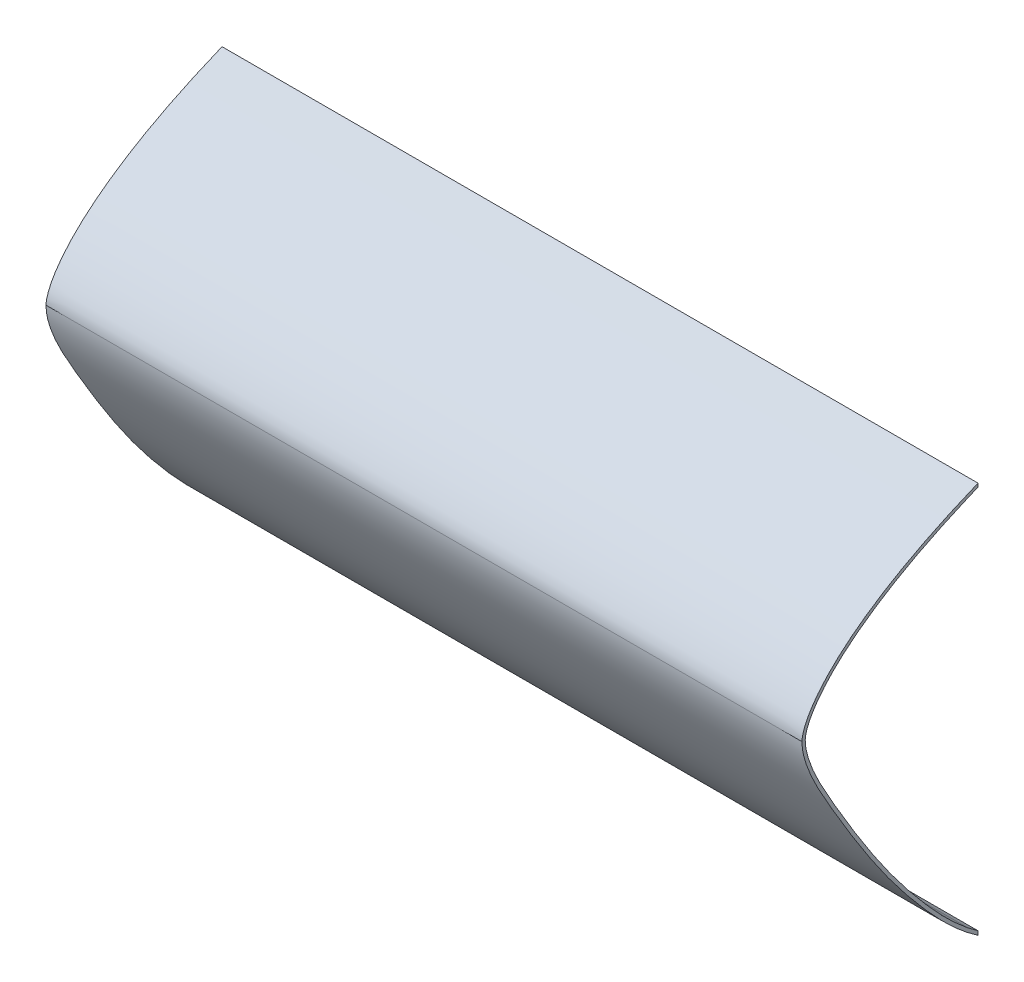
ISO-10303-21;
HEADER;
FILE_DESCRIPTION(('STEP AP214'),'2;1');
FILE_NAME('part.step','',(''),(''),'','','');
FILE_SCHEMA(('AUTOMOTIVE_DESIGN { 1 0 10303 214 1 1 1 1 }'));
ENDSEC;
DATA;
#1=APPLICATION_CONTEXT('core data for automotive mechanical design processes');
#2=APPLICATION_PROTOCOL_DEFINITION('international standard','automotive_design',2000,#1);
#3=PRODUCT_CONTEXT('',#1,'mechanical');
#4=PRODUCT('Part','Part','',(#3));
#5=PRODUCT_RELATED_PRODUCT_CATEGORY('part','',(#4));
#6=PRODUCT_DEFINITION_FORMATION('','',#4);
#7=PRODUCT_DEFINITION_CONTEXT('part definition',#1,'design');
#8=PRODUCT_DEFINITION('design','',#6,#7);
#9=PRODUCT_DEFINITION_SHAPE('','',#8);
#10=(LENGTH_UNIT() NAMED_UNIT(*) SI_UNIT(.MILLI.,.METRE.));
#11=(NAMED_UNIT(*) PLANE_ANGLE_UNIT() SI_UNIT($,.RADIAN.));
#12=(NAMED_UNIT(*) SI_UNIT($,.STERADIAN.) SOLID_ANGLE_UNIT());
#13=UNCERTAINTY_MEASURE_WITH_UNIT(LENGTH_MEASURE(1.E-05),#10,'distance_accuracy_value','');
#14=(GEOMETRIC_REPRESENTATION_CONTEXT(3) GLOBAL_UNCERTAINTY_ASSIGNED_CONTEXT((#13)) GLOBAL_UNIT_ASSIGNED_CONTEXT((#10,
#11,#12)) REPRESENTATION_CONTEXT('',''));
#15=CARTESIAN_POINT('',(0.,0.,0.));
#16=DIRECTION('',(0.,0.,1.));
#17=DIRECTION('',(1.,0.,0.));
#18=AXIS2_PLACEMENT_3D('',#15,#16,#17);
#19=CARTESIAN_POINT('',(266.7,-24.5074572882678,-789.290794794188));
#20=CARTESIAN_POINT('',(266.7,-23.100990822762,-780.614043856544));
#21=CARTESIAN_POINT('',(266.7,-21.0631816428031,-763.122872794764));
#22=CARTESIAN_POINT('',(266.7,-20.0352627306667,-736.775050872084));
#23=CARTESIAN_POINT('',(266.7,-20.2591998046104,-710.439693759353));
#24=CARTESIAN_POINT('',(266.7,-21.7598239259105,-675.368134105105));
#25=CARTESIAN_POINT('',(266.7,-25.5196834895329,-631.656292139503));
#26=CARTESIAN_POINT('',(266.7,-32.1431436086785,-579.449134828056));
#27=CARTESIAN_POINT('',(266.7,-40.3239611783185,-527.476779116881));
#28=CARTESIAN_POINT('',(266.7,-49.5822384711546,-475.697383860633));
#29=CARTESIAN_POINT('',(266.7,-59.4829281927388,-424.047472781757));
#30=CARTESIAN_POINT('',(266.7,-69.5596595695538,-372.441584722318));
#31=CARTESIAN_POINT('',(266.7,-79.2929568217852,-320.780260554555));
#32=CARTESIAN_POINT('',(266.7,-86.5747829680276,-277.588940898692));
#33=CARTESIAN_POINT('',(266.7,-91.4627744990053,-242.901110379607));
#34=CARTESIAN_POINT('',(266.7,-94.5068033648367,-216.810363835389));
#35=CARTESIAN_POINT('',(266.7,-96.7472514191075,-190.644182857328));
#36=CARTESIAN_POINT('',(266.7,-97.9545698036435,-164.414750871362));
#37=CARTESIAN_POINT('',(266.7,-97.7922976674635,-138.172359339796));
#38=CARTESIAN_POINT('',(266.7,-96.1813002834322,-116.355568341884));
#39=CARTESIAN_POINT('',(266.7,-93.5961307876831,-99.0883255351352));
#40=CARTESIAN_POINT('',(266.7,-90.8757461882616,-86.283147346043));
#41=CARTESIAN_POINT('',(266.7,-87.3558320405155,-73.6522350944922));
#42=CARTESIAN_POINT('',(266.7,-82.3375796283404,-61.6337008298024));
#43=CARTESIAN_POINT('',(266.7,-75.2474279990914,-50.6544833890106));
#44=CARTESIAN_POINT('',(266.7,-67.7200389950008,-42.8536104612325));
#45=CARTESIAN_POINT('',(266.7,-61.1825485276851,-37.0476347276397));
#46=CARTESIAN_POINT('',(266.7,-54.4810024514934,-31.45763959781));
#47=CARTESIAN_POINT('',(266.7,-45.7682269263305,-24.9199180091646));
#48=CARTESIAN_POINT('',(266.7,-34.7964723438076,-17.7321879669621));
#49=CARTESIAN_POINT('',(266.7,-25.4664029849051,-12.0814505739614));
#50=CARTESIAN_POINT('',(266.7,-17.8738398221118,-7.69425128420265));
#51=CARTESIAN_POINT('',(266.7,-12.1314475274385,-4.55768908706909));
#52=CARTESIAN_POINT('',(266.7,-7.20319801415783,-2.45214991226987));
#53=CARTESIAN_POINT('',(266.7,-3.59720544979583,-1.41675837015921));
#54=CARTESIAN_POINT('',(266.7,-1.82586056757744,-1.10276659026962));
#55=CARTESIAN_POINT('',(266.7,-0.823363516528401,-1.02892542519056));
#56=CARTESIAN_POINT('',(266.7,-0.277884035092441,-1.00992186429154));
#57=CARTESIAN_POINT('',(266.7,-0.0105715542449848,-1.00091942828998));
#58=B_SPLINE_CURVE_WITH_KNOTS('',3,(#19,#20,#21,#22,#23,#24,#25,#26,#27,#28,#29,#30,#31,#32,#33,
#34,#35,#36,#37,#38,#39,#40,#41,#42,#43,#44,#45,#46,#47,#48,#49,#50,#51,#52,#53,#54,#55,#56,
#57),.UNSPECIFIED.,.F.,.F.,(4,1,1,1,1,1,1,1,1,1,1,1,1,1,1,1,1,1,1,1,1,1,1,1,1,1,1,1,1,1,1,1,1,1,
1,1,4),(5.1726420586601E-05,0.0308151389199881,0.0615785514193897,0.0923419639187912,
0.123105376418193,0.184632201416996,0.246159026415799,0.307685851414602,0.369212676413405,
0.430739501412208,0.492266326411011,0.553793151409815,0.615319976408618,0.646083388908019,
0.676846801407421,0.707610213906822,0.738373626406224,0.769137038905625,0.799900451405027,
0.815282157654728,0.830663863904429,0.846045570154129,0.86142727640383,0.876808982653531,
0.892190688903232,0.899881542028082,0.907572395152932,0.922954101402633,0.938335807652334,
0.953717513902035,0.961408367026885,0.969099220151736,0.976790073276586,0.980635499839011,
0.982558213120224,0.98351956976083,0.984480926401436),.UNSPECIFIED.);
#59=DIRECTION('',(-1.,0.,0.));
#60=VECTOR('',#59,1.);
#61=SURFACE_OF_LINEAR_EXTRUSION('',#58,#60);
#62=CARTESIAN_POINT('',(34.925,-24.5074572882678,-789.290794794188));
#63=CARTESIAN_POINT('',(34.925,-23.100990822762,-780.614043856544));
#64=CARTESIAN_POINT('',(34.925,-21.0631816428031,-763.122872794764));
#65=CARTESIAN_POINT('',(34.925,-20.0352627306667,-736.775050872084));
#66=CARTESIAN_POINT('',(34.925,-20.2591998046104,-710.439693759353));
#67=CARTESIAN_POINT('',(34.925,-21.7598239259105,-675.368134105105));
#68=CARTESIAN_POINT('',(34.925,-25.5196834895329,-631.656292139503));
#69=CARTESIAN_POINT('',(34.925,-32.1431436086785,-579.449134828056));
#70=CARTESIAN_POINT('',(34.925,-40.3239611783185,-527.476779116881));
#71=CARTESIAN_POINT('',(34.925,-49.5822384711546,-475.697383860633));
#72=CARTESIAN_POINT('',(34.925,-59.4829281927388,-424.047472781757));
#73=CARTESIAN_POINT('',(34.925,-69.5596595695538,-372.441584722318));
#74=CARTESIAN_POINT('',(34.925,-79.2929568217852,-320.780260554555));
#75=CARTESIAN_POINT('',(34.925,-86.5747829680276,-277.588940898692));
#76=CARTESIAN_POINT('',(34.925,-91.4627744990053,-242.901110379607));
#77=CARTESIAN_POINT('',(34.925,-94.5068033648367,-216.810363835389));
#78=CARTESIAN_POINT('',(34.925,-96.7472514191075,-190.644182857328));
#79=CARTESIAN_POINT('',(34.925,-97.9545698036435,-164.414750871362));
#80=CARTESIAN_POINT('',(34.925,-97.7922976674635,-138.172359339796));
#81=CARTESIAN_POINT('',(34.925,-96.1813002834322,-116.355568341884));
#82=CARTESIAN_POINT('',(34.925,-93.5961307876831,-99.0883255351352));
#83=CARTESIAN_POINT('',(34.925,-90.8757461882616,-86.283147346043));
#84=CARTESIAN_POINT('',(34.925,-87.3558320405155,-73.6522350944922));
#85=CARTESIAN_POINT('',(34.925,-82.3375796283404,-61.6337008298024));
#86=CARTESIAN_POINT('',(34.925,-75.2474279990914,-50.6544833890106));
#87=CARTESIAN_POINT('',(34.925,-67.7200389950008,-42.8536104612325));
#88=CARTESIAN_POINT('',(34.925,-61.1825485276851,-37.0476347276397));
#89=CARTESIAN_POINT('',(34.925,-54.4810024514934,-31.45763959781));
#90=CARTESIAN_POINT('',(34.925,-45.7682269263305,-24.9199180091646));
#91=CARTESIAN_POINT('',(34.925,-34.7964723438076,-17.7321879669621));
#92=CARTESIAN_POINT('',(34.925,-25.4664029849051,-12.0814505739614));
#93=CARTESIAN_POINT('',(34.925,-17.8738398221118,-7.69425128420265));
#94=CARTESIAN_POINT('',(34.925,-12.1314475274385,-4.55768908706909));
#95=CARTESIAN_POINT('',(34.925,-7.20319801415783,-2.45214991226987));
#96=CARTESIAN_POINT('',(34.925,-3.59720544979583,-1.41675837015921));
#97=CARTESIAN_POINT('',(34.925,-1.82586056757744,-1.10276659026962));
#98=CARTESIAN_POINT('',(34.925,-0.823363516528401,-1.02892542519056));
#99=CARTESIAN_POINT('',(34.925,-0.277884035092441,-1.00992186429154));
#100=CARTESIAN_POINT('',(34.925,-0.0105715542449848,-1.00091942828998));
#101=B_SPLINE_CURVE_WITH_KNOTS('',3,(#62,#63,#64,#65,#66,#67,#68,#69,#70,#71,#72,#73,#74,#75,
#76,#77,#78,#79,#80,#81,#82,#83,#84,#85,#86,#87,#88,#89,#90,#91,#92,#93,#94,#95,#96,#97,#98,#99,
#100),.UNSPECIFIED.,.F.,.F.,(4,1,1,1,1,1,1,1,1,1,1,1,1,1,1,1,1,1,1,1,1,1,1,1,1,1,1,1,1,1,1,1,1,
1,1,1,4),(5.1726420586601E-05,0.0308151389199881,0.0615785514193897,0.0923419639187912,
0.123105376418193,0.184632201416996,0.246159026415799,0.307685851414602,0.369212676413405,
0.430739501412208,0.492266326411011,0.553793151409815,0.615319976408618,0.646083388908019,
0.676846801407421,0.707610213906822,0.738373626406224,0.769137038905625,0.799900451405027,
0.815282157654728,0.830663863904429,0.846045570154129,0.86142727640383,0.876808982653531,
0.892190688903232,0.899881542028082,0.907572395152932,0.922954101402633,0.938335807652334,
0.953717513902035,0.961408367026885,0.969099220151736,0.976790073276586,0.980635499839011,
0.982558213120224,0.98351956976083,0.984480926401436),.UNSPECIFIED.);
#102=CARTESIAN_POINT('',(34.925,-74.8249698289489,-50.7999999997794));
#103=VERTEX_POINT('',#102);
#104=CARTESIAN_POINT('',(34.925,-0.0105715542449848,-1.00091942828998));
#105=VERTEX_POINT('',#104);
#106=EDGE_CURVE('E210',#103,#105,#101,.T.);
#107=ORIENTED_EDGE('',*,*,#106,.T.);
#108=DIRECTION('',(-1.,0.,0.));
#109=VECTOR('',#108,1.);
#110=CARTESIAN_POINT('',(266.7,-0.0105715542449848,-1.00091942828998));
#111=LINE('',#110,#109);
#112=CARTESIAN_POINT('',(266.7,-0.0105715542449848,-1.00091942828998));
#113=VERTEX_POINT('',#112);
#114=EDGE_CURVE('E11',#113,#105,#111,.T.);
#115=ORIENTED_EDGE('',*,*,#114,.F.);
#116=CARTESIAN_POINT('',(266.7,-74.8249698289489,-50.7999999997794));
#117=VERTEX_POINT('',#116);
#118=EDGE_CURVE('E174',#117,#113,#58,.T.);
#119=ORIENTED_EDGE('',*,*,#118,.F.);
#120=DIRECTION('',(-1.,0.,0.));
#121=VECTOR('',#120,1.);
#122=CARTESIAN_POINT('',(266.7,-74.8249698289489,-50.7999999997794));
#123=LINE('',#122,#121);
#124=EDGE_CURVE('E40',#117,#103,#123,.T.);
#125=ORIENTED_EDGE('',*,*,#124,.T.);
#126=EDGE_LOOP('',(#107,#115,#119,#125));
#127=FACE_BOUND('',#126,.T.);
#128=ADVANCED_FACE('F36',(#127),#61,.F.);
#129=CARTESIAN_POINT('',(266.7,-0.0105715542452681,-1.00091942828997));
#130=CARTESIAN_POINT('',(266.7,0.114040702430054,-1.0077713892526));
#131=CARTESIAN_POINT('',(266.7,0.373573946351793,-1.02267814370625));
#132=CARTESIAN_POINT('',(266.7,0.808496425626842,-1.07091571810173));
#133=CARTESIAN_POINT('',(266.7,1.62955284660506,-1.23457798343074));
#134=CARTESIAN_POINT('',(266.7,3.28941724619422,-1.76639239978069));
#135=CARTESIAN_POINT('',(266.7,6.52065295439227,-3.32977957028124));
#136=CARTESIAN_POINT('',(266.7,10.7521230342508,-6.42954257803141));
#137=CARTESIAN_POINT('',(266.7,15.3220653664984,-10.7866624045209));
#138=CARTESIAN_POINT('',(266.7,19.4551389066011,-15.6144946537094));
#139=CARTESIAN_POINT('',(266.7,23.2421065636616,-20.7190912359694));
#140=CARTESIAN_POINT('',(266.7,27.8818635830338,-27.8301257757577));
#141=CARTESIAN_POINT('',(266.7,33.0526699425482,-37.1258570237104));
#142=CARTESIAN_POINT('',(266.7,38.4699988062142,-48.7006019533348));
#143=CARTESIAN_POINT('',(266.7,43.2586994140153,-60.554684269467));
#144=CARTESIAN_POINT('',(266.7,47.5157663270679,-72.6183427392226));
#145=CARTESIAN_POINT('',(266.7,52.5847537322259,-88.9109673754412));
#146=CARTESIAN_POINT('',(266.7,57.9456674243507,-109.571499581115));
#147=CARTESIAN_POINT('',(266.7,63.1156006005303,-134.662571043522));
#148=CARTESIAN_POINT('',(266.7,67.2137979677469,-159.955476890662));
#149=CARTESIAN_POINT('',(266.7,70.3743923087456,-185.386357323335));
#150=CARTESIAN_POINT('',(266.7,72.6538311658042,-210.910406797062));
#151=CARTESIAN_POINT('',(266.7,74.5203795449252,-245.029776596433));
#152=CARTESIAN_POINT('',(266.7,74.7799936498403,-279.21396421962));
#153=CARTESIAN_POINT('',(266.7,73.5458851692162,-313.365437183596));
#154=CARTESIAN_POINT('',(266.7,71.3203163709263,-347.467976918165));
#155=CARTESIAN_POINT('',(266.7,66.9977719420972,-389.985559505636));
#156=CARTESIAN_POINT('',(266.7,59.8424535642073,-440.766917426449));
#157=CARTESIAN_POINT('',(266.7,51.0591202019668,-491.296780074609));
#158=CARTESIAN_POINT('',(266.7,40.9550752519973,-541.58210338622));
#159=CARTESIAN_POINT('',(266.7,29.787578407225,-591.645313181676));
#160=CARTESIAN_POINT('',(266.7,19.7880426743993,-633.20668903599));
#161=CARTESIAN_POINT('',(266.7,11.4508482044253,-666.372578030713));
#162=CARTESIAN_POINT('',(266.7,5.03899993633112,-691.207818332635));
#163=CARTESIAN_POINT('',(266.7,-1.53568956714727,-715.996424383667));
#164=CARTESIAN_POINT('',(266.7,-8.35598015991596,-740.721778453262));
#165=CARTESIAN_POINT('',(266.7,-14.2813303329001,-761.239390145478));
#166=CARTESIAN_POINT('',(266.7,-19.8539671257288,-777.355415120436));
#167=CARTESIAN_POINT('',(266.7,-22.9508793400488,-785.3163619528));
#168=CARTESIAN_POINT('',(266.7,-24.5074572882678,-789.290794794188));
#169=B_SPLINE_CURVE_WITH_KNOTS('',3,(#129,#130,#131,#132,#133,#134,#135,#136,#137,#138,#139,
#140,#141,#142,#143,#144,#145,#146,#147,#148,#149,#150,#151,#152,#153,#154,#155,#156,#157,#158,
#159,#160,#161,#162,#163,#164,#165,#166,#167,#168),.UNSPECIFIED.,.F.,.F.,(4,1,1,1,1,1,1,1,1,1,1,
1,1,1,1,1,1,1,1,1,1,1,1,1,1,1,1,1,1,1,1,1,1,1,1,1,1,4),(0.0158982001693718,0.0163786926540949,
0.0168591851388182,0.0178201701082647,0.0197421400471575,0.0235860799249431,0.0312739596805144,
0.0389618394360858,0.0466497191916572,0.0543375989472285,0.0620254787027999,0.0774012382139426,
0.0927769977250852,0.108152757236228,0.123528516747371,0.138904276258513,0.169655795280799,
0.200407314303084,0.231158833325369,0.261910352347655,0.29266187136994,0.323413390392225,
0.384916428436796,0.415667947459081,0.446419466481367,0.507922504525937,0.569425542570508,
0.630928580615079,0.69243161865965,0.75393465670422,0.815437694748791,0.846189213771076,
0.876940732793362,0.907692251815647,0.938443770837933,0.969195289860218,0.984571049371361,
0.999946808882503),.UNSPECIFIED.);
#170=DIRECTION('',(-1.,0.,0.));
#171=VECTOR('',#170,1.);
#172=SURFACE_OF_LINEAR_EXTRUSION('',#169,#171);
#173=CARTESIAN_POINT('',(34.925,-0.0105715542452681,-1.00091942828997));
#174=CARTESIAN_POINT('',(34.925,0.114040702430054,-1.0077713892526));
#175=CARTESIAN_POINT('',(34.925,0.373573946351793,-1.02267814370625));
#176=CARTESIAN_POINT('',(34.925,0.808496425626842,-1.07091571810173));
#177=CARTESIAN_POINT('',(34.925,1.62955284660506,-1.23457798343074));
#178=CARTESIAN_POINT('',(34.925,3.28941724619422,-1.76639239978069));
#179=CARTESIAN_POINT('',(34.925,6.52065295439227,-3.32977957028124));
#180=CARTESIAN_POINT('',(34.925,10.7521230342508,-6.42954257803141));
#181=CARTESIAN_POINT('',(34.925,15.3220653664984,-10.7866624045209));
#182=CARTESIAN_POINT('',(34.925,19.4551389066011,-15.6144946537094));
#183=CARTESIAN_POINT('',(34.925,23.2421065636616,-20.7190912359694));
#184=CARTESIAN_POINT('',(34.925,27.8818635830338,-27.8301257757577));
#185=CARTESIAN_POINT('',(34.925,33.0526699425482,-37.1258570237104));
#186=CARTESIAN_POINT('',(34.925,38.4699988062142,-48.7006019533348));
#187=CARTESIAN_POINT('',(34.925,43.2586994140153,-60.554684269467));
#188=CARTESIAN_POINT('',(34.925,47.5157663270679,-72.6183427392226));
#189=CARTESIAN_POINT('',(34.925,52.5847537322259,-88.9109673754412));
#190=CARTESIAN_POINT('',(34.925,57.9456674243507,-109.571499581115));
#191=CARTESIAN_POINT('',(34.925,63.1156006005303,-134.662571043522));
#192=CARTESIAN_POINT('',(34.925,67.2137979677469,-159.955476890662));
#193=CARTESIAN_POINT('',(34.925,70.3743923087456,-185.386357323335));
#194=CARTESIAN_POINT('',(34.925,72.6538311658042,-210.910406797062));
#195=CARTESIAN_POINT('',(34.925,74.5203795449252,-245.029776596433));
#196=CARTESIAN_POINT('',(34.925,74.7799936498403,-279.21396421962));
#197=CARTESIAN_POINT('',(34.925,73.5458851692162,-313.365437183596));
#198=CARTESIAN_POINT('',(34.925,71.3203163709263,-347.467976918165));
#199=CARTESIAN_POINT('',(34.925,66.9977719420972,-389.985559505636));
#200=CARTESIAN_POINT('',(34.925,59.8424535642073,-440.766917426449));
#201=CARTESIAN_POINT('',(34.925,51.0591202019668,-491.296780074609));
#202=CARTESIAN_POINT('',(34.925,40.9550752519973,-541.58210338622));
#203=CARTESIAN_POINT('',(34.925,29.787578407225,-591.645313181676));
#204=CARTESIAN_POINT('',(34.925,19.7880426743993,-633.20668903599));
#205=CARTESIAN_POINT('',(34.925,11.4508482044253,-666.372578030713));
#206=CARTESIAN_POINT('',(34.925,5.03899993633112,-691.207818332635));
#207=CARTESIAN_POINT('',(34.925,-1.53568956714727,-715.996424383667));
#208=CARTESIAN_POINT('',(34.925,-8.35598015991596,-740.721778453262));
#209=CARTESIAN_POINT('',(34.925,-14.2813303329001,-761.239390145478));
#210=CARTESIAN_POINT('',(34.925,-19.8539671257288,-777.355415120436));
#211=CARTESIAN_POINT('',(34.925,-22.9508793400488,-785.3163619528));
#212=CARTESIAN_POINT('',(34.925,-24.5074572882678,-789.290794794188));
#213=B_SPLINE_CURVE_WITH_KNOTS('',3,(#173,#174,#175,#176,#177,#178,#179,#180,#181,#182,#183,
#184,#185,#186,#187,#188,#189,#190,#191,#192,#193,#194,#195,#196,#197,#198,#199,#200,#201,#202,
#203,#204,#205,#206,#207,#208,#209,#210,#211,#212),.UNSPECIFIED.,.F.,.F.,(4,1,1,1,1,1,1,1,1,1,1,
1,1,1,1,1,1,1,1,1,1,1,1,1,1,1,1,1,1,1,1,1,1,1,1,1,1,4),(0.0158982001693718,0.0163786926540949,
0.0168591851388182,0.0178201701082647,0.0197421400471575,0.0235860799249431,0.0312739596805144,
0.0389618394360858,0.0466497191916572,0.0543375989472285,0.0620254787027999,0.0774012382139426,
0.0927769977250852,0.108152757236228,0.123528516747371,0.138904276258513,0.169655795280799,
0.200407314303084,0.231158833325369,0.261910352347655,0.29266187136994,0.323413390392225,
0.384916428436796,0.415667947459081,0.446419466481367,0.507922504525937,0.569425542570508,
0.630928580615079,0.69243161865965,0.75393465670422,0.815437694748791,0.846189213771076,
0.876940732793362,0.907692251815647,0.938443770837933,0.969195289860218,0.984571049371361,
0.999946808882503),.UNSPECIFIED.);
#214=CARTESIAN_POINT('',(34.925,39.2481231711083,-50.8));
#215=VERTEX_POINT('',#214);
#216=EDGE_CURVE('E88',#105,#215,#213,.T.);
#217=ORIENTED_EDGE('',*,*,#216,.T.);
#218=DIRECTION('',(-1.,0.,0.));
#219=VECTOR('',#218,1.);
#220=CARTESIAN_POINT('',(266.7,39.2481231711083,-50.8));
#221=LINE('',#220,#219);
#222=CARTESIAN_POINT('',(266.7,39.2481231711083,-50.8));
#223=VERTEX_POINT('',#222);
#224=EDGE_CURVE('E46',#223,#215,#221,.T.);
#225=ORIENTED_EDGE('',*,*,#224,.F.);
#226=EDGE_CURVE('E54',#113,#223,#169,.T.);
#227=ORIENTED_EDGE('',*,*,#226,.F.);
#228=ORIENTED_EDGE('',*,*,#114,.T.);
#229=EDGE_LOOP('',(#217,#225,#227,#228));
#230=FACE_BOUND('',#229,.T.);
#231=ADVANCED_FACE('F149',(#230),#172,.F.);
#232=CARTESIAN_POINT('',(266.7,-24.5074523147149,-789.290776610833));
#233=CARTESIAN_POINT('',(266.7,-22.9508744367013,-785.316343884076));
#234=CARTESIAN_POINT('',(266.7,-19.8539626401927,-777.355397182078));
#235=CARTESIAN_POINT('',(266.7,-14.2813269120629,-761.239372327148));
#236=CARTESIAN_POINT('',(266.7,-8.35597741402668,-740.721760986467));
#237=CARTESIAN_POINT('',(266.7,-1.53568705011436,-715.996407484722));
#238=CARTESIAN_POINT('',(266.7,5.03900213459,-691.207801971334));
#239=CARTESIAN_POINT('',(266.7,11.4508501691391,-666.372562229981));
#240=CARTESIAN_POINT('',(266.7,19.7880443068953,-633.206673978885));
#241=CARTESIAN_POINT('',(266.7,29.7875796313035,-591.645299060978));
#242=CARTESIAN_POINT('',(266.7,40.9550759630107,-541.582090396035));
#243=CARTESIAN_POINT('',(266.7,51.059120386154,-491.296768227991));
#244=CARTESIAN_POINT('',(266.7,59.8424532201647,-440.766906741374));
#245=CARTESIAN_POINT('',(266.7,66.9977710701701,-389.985550008334));
#246=CARTESIAN_POINT('',(266.7,71.320315093406,-347.467968433537));
#247=CARTESIAN_POINT('',(266.7,73.5458835501345,-313.365429537516));
#248=CARTESIAN_POINT('',(266.7,74.7799917159271,-279.21395742446));
#249=CARTESIAN_POINT('',(266.7,74.5203773652254,-245.029770666932));
#250=CARTESIAN_POINT('',(266.7,72.6538287923752,-210.910401752373));
#251=CARTESIAN_POINT('',(266.7,70.3743898225911,-185.386352949068));
#252=CARTESIAN_POINT('',(266.7,67.2137954131363,-159.955473188296));
#253=CARTESIAN_POINT('',(266.7,63.1155980063945,-134.662568023428));
#254=CARTESIAN_POINT('',(266.7,57.945664824236,-109.57149725794));
#255=CARTESIAN_POINT('',(266.7,52.5847511620715,-88.9109656463125));
#256=CARTESIAN_POINT('',(266.7,47.5157638070041,-72.6183415034526));
#257=CARTESIAN_POINT('',(266.7,43.2586969489353,-60.5546834115465));
#258=CARTESIAN_POINT('',(266.7,38.4699964176601,-48.7006014884342));
#259=CARTESIAN_POINT('',(266.7,33.0526676620866,-37.1258569671738));
#260=CARTESIAN_POINT('',(266.7,27.8818614287451,-27.830126078208));
#261=CARTESIAN_POINT('',(266.7,23.2421045519939,-20.7190918518584));
#262=CARTESIAN_POINT('',(266.7,19.4551370279139,-15.6144955117341));
#263=CARTESIAN_POINT('',(266.7,15.322063664281,-10.7866635242817));
#264=CARTESIAN_POINT('',(266.7,10.7521215765983,-6.42954397937692));
#265=CARTESIAN_POINT('',(266.7,6.52065180860318,-3.32978123179313));
#266=CARTESIAN_POINT('',(266.7,3.2894164680873,-1.76639425342375));
#267=CARTESIAN_POINT('',(266.7,1.62955235710492,-1.23457992726384));
#268=CARTESIAN_POINT('',(266.7,0.808496148203222,-1.07091770373055));
#269=CARTESIAN_POINT('',(266.7,0.37357387230636,-1.02268014491042));
#270=CARTESIAN_POINT('',(266.7,0.114040657530818,-1.00777338993929));
#271=CARTESIAN_POINT('',(266.7,-0.0105715755317698,-1.00092143014071));
#272=B_SPLINE_CURVE_WITH_KNOTS('',3,(#232,#233,#234,#235,#236,#237,#238,#239,#240,#241,#242,
#243,#244,#245,#246,#247,#248,#249,#250,#251,#252,#253,#254,#255,#256,#257,#258,#259,#260,#261,
#262,#263,#264,#265,#266,#267,#268,#269,#270,#271),.UNSPECIFIED.,.F.,.F.,(4,1,1,1,1,1,1,1,1,1,1,
1,1,1,1,1,1,1,1,1,1,1,1,1,1,1,1,1,1,1,1,1,1,1,1,1,1,4),(0.0158982226359171,0.0312739817943404,
0.0466497409527636,0.07740125926961,0.108152777586456,0.138904295903303,0.169655814220149,
0.200407332536996,0.261910369170689,0.323413405804382,0.384916442438075,0.446419479071767,
0.50792251570546,0.569425552339153,0.600177070656,0.630928588972846,0.692431625606539,
0.723183143923385,0.753934662240232,0.784686180557078,0.815437698873925,0.846189217190771,
0.876940735507618,0.892316494666041,0.907692253824464,0.923068012982887,0.938443772141311,
0.953819531299734,0.961507410878945,0.969195290458157,0.976883170037369,0.98457104961658,
0.992258929195792,0.996102868985398,0.998024838880201,0.998985823827602,0.999466316301303,
0.999946808775004),.UNSPECIFIED.);
#273=DIRECTION('',(-1.,0.,0.));
#274=VECTOR('',#273,1.);
#275=SURFACE_OF_LINEAR_EXTRUSION('',#272,#274);
#276=CARTESIAN_POINT('',(34.925,-24.5074523147149,-789.290776610833));
#277=CARTESIAN_POINT('',(34.925,-22.9508744367013,-785.316343884076));
#278=CARTESIAN_POINT('',(34.925,-19.8539626401927,-777.355397182078));
#279=CARTESIAN_POINT('',(34.925,-14.2813269120629,-761.239372327148));
#280=CARTESIAN_POINT('',(34.925,-8.35597741402668,-740.721760986467));
#281=CARTESIAN_POINT('',(34.925,-1.53568705011436,-715.996407484722));
#282=CARTESIAN_POINT('',(34.925,5.03900213459,-691.207801971334));
#283=CARTESIAN_POINT('',(34.925,11.4508501691391,-666.372562229981));
#284=CARTESIAN_POINT('',(34.925,19.7880443068953,-633.206673978885));
#285=CARTESIAN_POINT('',(34.925,29.7875796313035,-591.645299060978));
#286=CARTESIAN_POINT('',(34.925,40.9550759630107,-541.582090396035));
#287=CARTESIAN_POINT('',(34.925,51.059120386154,-491.296768227991));
#288=CARTESIAN_POINT('',(34.925,59.8424532201647,-440.766906741374));
#289=CARTESIAN_POINT('',(34.925,66.9977710701701,-389.985550008334));
#290=CARTESIAN_POINT('',(34.925,71.320315093406,-347.467968433537));
#291=CARTESIAN_POINT('',(34.925,73.5458835501345,-313.365429537516));
#292=CARTESIAN_POINT('',(34.925,74.7799917159271,-279.21395742446));
#293=CARTESIAN_POINT('',(34.925,74.5203773652254,-245.029770666932));
#294=CARTESIAN_POINT('',(34.925,72.6538287923752,-210.910401752373));
#295=CARTESIAN_POINT('',(34.925,70.3743898225911,-185.386352949068));
#296=CARTESIAN_POINT('',(34.925,67.2137954131363,-159.955473188296));
#297=CARTESIAN_POINT('',(34.925,63.1155980063945,-134.662568023428));
#298=CARTESIAN_POINT('',(34.925,57.945664824236,-109.57149725794));
#299=CARTESIAN_POINT('',(34.925,52.5847511620715,-88.9109656463125));
#300=CARTESIAN_POINT('',(34.925,47.5157638070041,-72.6183415034526));
#301=CARTESIAN_POINT('',(34.925,43.2586969489353,-60.5546834115465));
#302=CARTESIAN_POINT('',(34.925,38.4699964176601,-48.7006014884342));
#303=CARTESIAN_POINT('',(34.925,33.0526676620866,-37.1258569671738));
#304=CARTESIAN_POINT('',(34.925,27.8818614287451,-27.830126078208));
#305=CARTESIAN_POINT('',(34.925,23.2421045519939,-20.7190918518584));
#306=CARTESIAN_POINT('',(34.925,19.4551370279139,-15.6144955117341));
#307=CARTESIAN_POINT('',(34.925,15.322063664281,-10.7866635242817));
#308=CARTESIAN_POINT('',(34.925,10.7521215765983,-6.42954397937692));
#309=CARTESIAN_POINT('',(34.925,6.52065180860318,-3.32978123179313));
#310=CARTESIAN_POINT('',(34.925,3.2894164680873,-1.76639425342375));
#311=CARTESIAN_POINT('',(34.925,1.62955235710492,-1.23457992726384));
#312=CARTESIAN_POINT('',(34.925,0.808496148203222,-1.07091770373055));
#313=CARTESIAN_POINT('',(34.925,0.37357387230636,-1.02268014491042));
#314=CARTESIAN_POINT('',(34.925,0.114040657530818,-1.00777338993929));
#315=CARTESIAN_POINT('',(34.925,-0.0105715755317698,-1.00092143014071));
#316=B_SPLINE_CURVE_WITH_KNOTS('',3,(#276,#277,#278,#279,#280,#281,#282,#283,#284,#285,#286,
#287,#288,#289,#290,#291,#292,#293,#294,#295,#296,#297,#298,#299,#300,#301,#302,#303,#304,#305,
#306,#307,#308,#309,#310,#311,#312,#313,#314,#315),.UNSPECIFIED.,.F.,.F.,(4,1,1,1,1,1,1,1,1,1,1,
1,1,1,1,1,1,1,1,1,1,1,1,1,1,1,1,1,1,1,1,1,1,1,1,1,1,4),(0.0158982226359171,0.0312739817943404,
0.0466497409527636,0.07740125926961,0.108152777586456,0.138904295903303,0.169655814220149,
0.200407332536996,0.261910369170689,0.323413405804382,0.384916442438075,0.446419479071767,
0.50792251570546,0.569425552339153,0.600177070656,0.630928588972846,0.692431625606539,
0.723183143923385,0.753934662240232,0.784686180557078,0.815437698873925,0.846189217190771,
0.876940735507618,0.892316494666041,0.907692253824464,0.923068012982887,0.938443772141311,
0.953819531299734,0.961507410878945,0.969195290458157,0.976883170037369,0.98457104961658,
0.992258929195792,0.996102868985398,0.998024838880201,0.998985823827602,0.999466316301303,
0.999946808775004),.UNSPECIFIED.);
#317=CARTESIAN_POINT('',(34.925,40.570467672655,-53.975));
#318=VERTEX_POINT('',#317);
#319=EDGE_CURVE('E113',#318,#215,#316,.T.);
#320=ORIENTED_EDGE('',*,*,#319,.F.);
#321=DIRECTION('',(-1.,0.,0.));
#322=VECTOR('',#321,1.);
#323=CARTESIAN_POINT('',(266.7,40.570467672655,-53.975));
#324=LINE('',#323,#322);
#325=CARTESIAN_POINT('',(266.7,40.570467672655,-53.975));
#326=VERTEX_POINT('',#325);
#327=EDGE_CURVE('E108',#326,#318,#324,.T.);
#328=ORIENTED_EDGE('',*,*,#327,.F.);
#329=EDGE_CURVE('E112',#326,#223,#272,.T.);
#330=ORIENTED_EDGE('',*,*,#329,.T.);
#331=ORIENTED_EDGE('',*,*,#224,.T.);
#332=EDGE_LOOP('',(#320,#328,#330,#331));
#333=FACE_BOUND('',#332,.T.);
#334=ADVANCED_FACE('F110',(#333),#275,.T.);
#335=CARTESIAN_POINT('',(266.7,0.,-53.975));
#336=DIRECTION('',(0.,0.,1.));
#337=DIRECTION('',(0.,-1.,0.));
#338=AXIS2_PLACEMENT_3D('',#335,#336,#337);
#339=PLANE('',#338);
#340=DIRECTION('',(0.,1.,0.));
#341=VECTOR('',#340,1.);
#342=CARTESIAN_POINT('',(34.925,0.,-53.975));
#343=LINE('',#342,#341);
#344=CARTESIAN_POINT('',(34.925,41.6510394030179,-53.975));
#345=VERTEX_POINT('',#344);
#346=EDGE_CURVE('E187',#318,#345,#343,.T.);
#347=ORIENTED_EDGE('',*,*,#346,.T.);
#348=DIRECTION('',(-1.,0.,0.));
#349=VECTOR('',#348,1.);
#350=CARTESIAN_POINT('',(266.7,41.6510394030179,-53.975));
#351=LINE('',#350,#349);
#352=CARTESIAN_POINT('',(266.7,41.6510394030179,-53.975));
#353=VERTEX_POINT('',#352);
#354=EDGE_CURVE('E116',#353,#345,#351,.T.);
#355=ORIENTED_EDGE('',*,*,#354,.F.);
#356=DIRECTION('',(0.,1.,0.));
#357=VECTOR('',#356,1.);
#358=CARTESIAN_POINT('',(266.7,0.,-53.975));
#359=LINE('',#358,#357);
#360=EDGE_CURVE('E119',#326,#353,#359,.T.);
#361=ORIENTED_EDGE('',*,*,#360,.F.);
#362=ORIENTED_EDGE('',*,*,#327,.T.);
#363=EDGE_LOOP('',(#347,#355,#361,#362));
#364=FACE_BOUND('',#363,.T.);
#365=ADVANCED_FACE('F120',(#364),#339,.F.);
#366=CARTESIAN_POINT('',(266.7,-28.0117320332953,-802.151053398607));
#367=CARTESIAN_POINT('',(266.7,-27.710542123527,-801.137231832094));
#368=CARTESIAN_POINT('',(266.7,-26.5641562510043,-797.27843482904));
#369=CARTESIAN_POINT('',(266.7,-23.4586005929967,-789.357225955684));
#370=CARTESIAN_POINT('',(266.7,-18.6435790763375,-777.061460680268));
#371=CARTESIAN_POINT('',(266.7,-13.0400649658381,-760.581722213746));
#372=CARTESIAN_POINT('',(266.7,-7.12332820030123,-739.996750309993));
#373=CARTESIAN_POINT('',(266.7,-0.379813283345798,-715.577161880778));
#374=CARTESIAN_POINT('',(266.7,7.01302179783245,-687.646997388539));
#375=CARTESIAN_POINT('',(266.7,14.9584437350511,-656.683490082775));
#376=CARTESIAN_POINT('',(266.7,23.2583450492127,-623.158916560161));
#377=CARTESIAN_POINT('',(266.7,31.6943761736674,-587.549187867877));
#378=CARTESIAN_POINT('',(266.7,40.0261592775003,-550.319226889969));
#379=CARTESIAN_POINT('',(266.7,48.0016259470583,-511.914813654707));
#380=CARTESIAN_POINT('',(266.7,55.3745384751683,-472.761711336754));
#381=CARTESIAN_POINT('',(266.7,61.9127756172881,-433.262164148396));
#382=CARTESIAN_POINT('',(266.7,67.4048011857371,-393.795881301516));
#383=CARTESIAN_POINT('',(266.7,71.6551802592027,-354.719946084308));
#384=CARTESIAN_POINT('',(266.7,74.5356984509869,-316.356950184404));
#385=CARTESIAN_POINT('',(266.7,75.7535877143478,-278.931254813958));
#386=CARTESIAN_POINT('',(266.7,75.3938232859782,-242.699408929645));
#387=CARTESIAN_POINT('',(266.7,73.5466559514192,-207.870582877272));
#388=CARTESIAN_POINT('',(266.7,70.258980651523,-174.746776105035));
#389=CARTESIAN_POINT('',(266.7,65.7681833794804,-143.601377812826));
#390=CARTESIAN_POINT('',(266.7,60.1874606388379,-114.762118238718));
#391=CARTESIAN_POINT('',(266.7,53.6284711640925,-88.5344901534865));
#392=CARTESIAN_POINT('',(266.7,46.2382231047102,-65.1989800418067));
#393=CARTESIAN_POINT('',(266.7,38.1338729096646,-45.0005898028485));
#394=CARTESIAN_POINT('',(266.7,29.5092329049809,-28.1586169294181));
#395=CARTESIAN_POINT('',(266.7,20.5578270147304,-14.8710331109971));
#396=CARTESIAN_POINT('',(266.7,12.3132643572985,-6.1441914315733));
#397=CARTESIAN_POINT('',(266.7,6.17648660122838,-1.94810257769001));
#398=CARTESIAN_POINT('',(266.7,3.08412263305227,-0.639134364132099));
#399=CARTESIAN_POINT('',(266.7,1.6680303470529,-0.217045478268119));
#400=CARTESIAN_POINT('',(266.7,0.777840261416918,-0.0425630889701045));
#401=CARTESIAN_POINT('',(266.7,0.196310087268892,-0.0107420046483453));
#402=CARTESIAN_POINT('',(266.7,0.,0.));
#403=B_SPLINE_CURVE_WITH_KNOTS('',3,(#366,#367,#368,#369,#370,#371,#372,#373,#374,#375,#376,
#377,#378,#379,#380,#381,#382,#383,#384,#385,#386,#387,#388,#389,#390,#391,#392,#393,#394,#395,
#396,#397,#398,#399,#400,#401,#402),.UNSPECIFIED.,.F.,.F.,(4,1,1,1,1,1,1,1,1,1,1,1,1,1,1,1,1,1,
1,1,1,1,1,1,1,1,1,1,1,1,1,1,1,1,4),(0.,0.0038023449945569,0.0144724456001439,0.0305636248499039,
0.0512990586437873,0.0770284704780323,0.1075738110133,0.142399412839652,0.180921149261364,
0.222524680037491,0.266590974271359,0.312514686460119,0.359710118436383,0.407632336843648,
0.455773216728113,0.503669018265595,0.550900956266296,0.59709618330248,0.64197604819215,
0.685511898484932,0.727353251544964,0.767353583197193,0.805169064220494,0.840471251936796,
0.872937278412314,0.902335208905147,0.928425322985344,0.95111304623239,0.970252676129248,
0.985871491026606,0.993981783732224,0.996752649298779,0.997906779196307,0.999293380847839,1.),.UNSPECIFIED.);
#404=DIRECTION('',(-1.,0.,0.));
#405=VECTOR('',#404,1.);
#406=SURFACE_OF_LINEAR_EXTRUSION('',#403,#405);
#407=CARTESIAN_POINT('',(34.925,-28.0117320332953,-802.151053398607));
#408=CARTESIAN_POINT('',(34.925,-27.710542123527,-801.137231832094));
#409=CARTESIAN_POINT('',(34.925,-26.5641562510043,-797.27843482904));
#410=CARTESIAN_POINT('',(34.925,-23.4586005929967,-789.357225955684));
#411=CARTESIAN_POINT('',(34.925,-18.6435790763375,-777.061460680268));
#412=CARTESIAN_POINT('',(34.925,-13.0400649658381,-760.581722213746));
#413=CARTESIAN_POINT('',(34.925,-7.12332820030123,-739.996750309993));
#414=CARTESIAN_POINT('',(34.925,-0.379813283345798,-715.577161880778));
#415=CARTESIAN_POINT('',(34.925,7.01302179783245,-687.646997388539));
#416=CARTESIAN_POINT('',(34.925,14.9584437350511,-656.683490082775));
#417=CARTESIAN_POINT('',(34.925,23.2583450492127,-623.158916560161));
#418=CARTESIAN_POINT('',(34.925,31.6943761736674,-587.549187867877));
#419=CARTESIAN_POINT('',(34.925,40.0261592775003,-550.319226889969));
#420=CARTESIAN_POINT('',(34.925,48.0016259470583,-511.914813654707));
#421=CARTESIAN_POINT('',(34.925,55.3745384751683,-472.761711336754));
#422=CARTESIAN_POINT('',(34.925,61.9127756172881,-433.262164148396));
#423=CARTESIAN_POINT('',(34.925,67.4048011857371,-393.795881301516));
#424=CARTESIAN_POINT('',(34.925,71.6551802592027,-354.719946084308));
#425=CARTESIAN_POINT('',(34.925,74.5356984509869,-316.356950184404));
#426=CARTESIAN_POINT('',(34.925,75.7535877143478,-278.931254813958));
#427=CARTESIAN_POINT('',(34.925,75.3938232859782,-242.699408929645));
#428=CARTESIAN_POINT('',(34.925,73.5466559514192,-207.870582877272));
#429=CARTESIAN_POINT('',(34.925,70.258980651523,-174.746776105035));
#430=CARTESIAN_POINT('',(34.925,65.7681833794804,-143.601377812826));
#431=CARTESIAN_POINT('',(34.925,60.1874606388379,-114.762118238718));
#432=CARTESIAN_POINT('',(34.925,53.6284711640925,-88.5344901534865));
#433=CARTESIAN_POINT('',(34.925,46.2382231047102,-65.1989800418067));
#434=CARTESIAN_POINT('',(34.925,38.1338729096646,-45.0005898028485));
#435=CARTESIAN_POINT('',(34.925,29.5092329049809,-28.1586169294181));
#436=CARTESIAN_POINT('',(34.925,20.5578270147304,-14.8710331109971));
#437=CARTESIAN_POINT('',(34.925,12.3132643572985,-6.1441914315733));
#438=CARTESIAN_POINT('',(34.925,6.17648660122838,-1.94810257769001));
#439=CARTESIAN_POINT('',(34.925,3.08412263305227,-0.639134364132099));
#440=CARTESIAN_POINT('',(34.925,1.6680303470529,-0.217045478268119));
#441=CARTESIAN_POINT('',(34.925,0.777840261416918,-0.0425630889701045));
#442=CARTESIAN_POINT('',(34.925,0.196310087268892,-0.0107420046483453));
#443=CARTESIAN_POINT('',(34.925,0.,0.));
#444=B_SPLINE_CURVE_WITH_KNOTS('',3,(#407,#408,#409,#410,#411,#412,#413,#414,#415,#416,#417,
#418,#419,#420,#421,#422,#423,#424,#425,#426,#427,#428,#429,#430,#431,#432,#433,#434,#435,#436,
#437,#438,#439,#440,#441,#442,#443),.UNSPECIFIED.,.F.,.F.,(4,1,1,1,1,1,1,1,1,1,1,1,1,1,1,1,1,1,
1,1,1,1,1,1,1,1,1,1,1,1,1,1,1,1,4),(0.,0.0038023449945569,0.0144724456001439,0.0305636248499039,
0.0512990586437873,0.0770284704780323,0.1075738110133,0.142399412839652,0.180921149261364,
0.222524680037491,0.266590974271359,0.312514686460119,0.359710118436383,0.407632336843648,
0.455773216728113,0.503669018265595,0.550900956266296,0.59709618330248,0.64197604819215,
0.685511898484932,0.727353251544964,0.767353583197193,0.805169064220494,0.840471251936796,
0.872937278412314,0.902335208905147,0.928425322985344,0.95111304623239,0.970252676129248,
0.985871491026606,0.993981783732224,0.996752649298779,0.997906779196307,0.999293380847839,1.),.UNSPECIFIED.);
#445=CARTESIAN_POINT('',(34.925,0.,0.));
#446=VERTEX_POINT('',#445);
#447=EDGE_CURVE('E229',#345,#446,#444,.T.);
#448=ORIENTED_EDGE('',*,*,#447,.T.);
#449=DIRECTION('',(-1.,0.,0.));
#450=VECTOR('',#449,1.);
#451=CARTESIAN_POINT('',(266.7,0.,0.));
#452=LINE('',#451,#450);
#453=CARTESIAN_POINT('',(266.7,0.,0.));
#454=VERTEX_POINT('',#453);
#455=EDGE_CURVE('E200',#454,#446,#452,.T.);
#456=ORIENTED_EDGE('',*,*,#455,.F.);
#457=EDGE_CURVE('E124',#353,#454,#403,.T.);
#458=ORIENTED_EDGE('',*,*,#457,.F.);
#459=ORIENTED_EDGE('',*,*,#354,.T.);
#460=EDGE_LOOP('',(#448,#456,#458,#459));
#461=FACE_BOUND('',#460,.T.);
#462=ADVANCED_FACE('F153',(#461),#406,.F.);
#463=CARTESIAN_POINT('',(266.7,0.,0.));
#464=CARTESIAN_POINT('',(266.7,-0.519005663292632,-0.0174520328861116));
#465=CARTESIAN_POINT('',(266.7,-1.83376590693266,-0.061662030289511));
#466=CARTESIAN_POINT('',(266.7,-4.39681155697538,-0.570189514846942));
#467=CARTESIAN_POINT('',(266.7,-10.616386461847,-2.53612961983818));
#468=CARTESIAN_POINT('',(266.7,-20.5501355548529,-7.99821180017807));
#469=CARTESIAN_POINT('',(266.7,-34.1849518234535,-16.113653600375));
#470=CARTESIAN_POINT('',(266.7,-48.9001609581786,-25.7512677237822));
#471=CARTESIAN_POINT('',(266.7,-62.9387722638163,-36.9320129206869));
#472=CARTESIAN_POINT('',(266.7,-75.9185649305712,-49.3363693896182));
#473=CARTESIAN_POINT('',(266.7,-85.624987008219,-65.2269065390065));
#474=CARTESIAN_POINT('',(266.7,-91.71735718507,-84.4527650462028));
#475=CARTESIAN_POINT('',(266.7,-96.1515107337894,-106.852134497523));
#476=CARTESIAN_POINT('',(266.7,-98.5722491750476,-132.510932075963));
#477=CARTESIAN_POINT('',(266.7,-99.0923828679645,-161.194365788224));
#478=CARTESIAN_POINT('',(266.7,-97.7042437107787,-192.761343292225));
#479=CARTESIAN_POINT('',(266.7,-94.5118392960459,-227.038217577419));
#480=CARTESIAN_POINT('',(266.7,-89.663828122523,-263.83475650239));
#481=CARTESIAN_POINT('',(266.7,-83.3884450275924,-302.921473177171));
#482=CARTESIAN_POINT('',(266.7,-75.9777868038423,-344.017776041379));
#483=CARTESIAN_POINT('',(266.7,-67.7807073824771,-386.776799789042));
#484=CARTESIAN_POINT('',(266.7,-59.2023239554423,-430.774614869895));
#485=CARTESIAN_POINT('',(266.7,-50.6638051202139,-475.496263681326));
#486=CARTESIAN_POINT('',(266.7,-42.603612471025,-520.335279967164));
#487=CARTESIAN_POINT('',(266.7,-35.4227963472458,-564.588870456427));
#488=CARTESIAN_POINT('',(266.7,-29.4733080838417,-607.47093439983));
#489=CARTESIAN_POINT('',(266.7,-25.014473383068,-648.127538759033));
#490=CARTESIAN_POINT('',(266.7,-22.1862417823146,-685.667615873141));
#491=CARTESIAN_POINT('',(266.7,-21.0047614095552,-719.196759596274));
#492=CARTESIAN_POINT('',(266.7,-21.2786363123237,-747.830287498204));
#493=CARTESIAN_POINT('',(266.7,-22.8547119223691,-770.688405742871));
#494=CARTESIAN_POINT('',(266.7,-25.0735156397946,-787.091395164099));
#495=CARTESIAN_POINT('',(266.7,-26.8193281874914,-796.842303094868));
#496=CARTESIAN_POINT('',(266.7,-27.775140745329,-801.097715575015));
#497=CARTESIAN_POINT('',(266.7,-28.0117320332953,-802.151053398607));
#498=B_SPLINE_CURVE_WITH_KNOTS('',3,(#463,#464,#465,#466,#467,#468,#469,#470,#471,#472,#473,
#474,#475,#476,#477,#478,#479,#480,#481,#482,#483,#484,#485,#486,#487,#488,#489,#490,#491,#492,
#493,#494,#495,#496,#497),.UNSPECIFIED.,.F.,.F.,(4,1,1,1,1,1,1,1,1,1,1,1,1,1,1,1,1,1,1,1,1,1,1,
1,1,1,1,1,1,1,1,1,4),(0.,0.00182090933464196,0.00461278049497482,0.00913453013845994,
0.0246759391487866,0.0441527676320363,0.064937102928184,0.0863209881898911,0.107137618403306,
0.127599776801144,0.150892792929449,0.177565203441126,0.207667777211646,0.241222088418686,
0.278203414074027,0.318526302563412,0.362030578586225,0.408464624639153,0.457479061609077,
0.508614437318857,0.56129601455956,0.61483529472868,0.668437533813961,0.721214466101836,
0.772202341152847,0.82039348306447,0.86476592329606,0.904323703961063,0.938131580580512,
0.965241743376092,0.984690446789536,0.996210442222917,1.),.UNSPECIFIED.);
#499=DIRECTION('',(-1.,0.,0.));
#500=VECTOR('',#499,1.);
#501=SURFACE_OF_LINEAR_EXTRUSION('',#498,#500);
#502=CARTESIAN_POINT('',(34.925,0.,0.));
#503=CARTESIAN_POINT('',(34.925,-0.519005663292632,-0.0174520328861116));
#504=CARTESIAN_POINT('',(34.925,-1.83376590693266,-0.061662030289511));
#505=CARTESIAN_POINT('',(34.925,-4.39681155697538,-0.570189514846942));
#506=CARTESIAN_POINT('',(34.925,-10.616386461847,-2.53612961983818));
#507=CARTESIAN_POINT('',(34.925,-20.5501355548529,-7.99821180017807));
#508=CARTESIAN_POINT('',(34.925,-34.1849518234535,-16.113653600375));
#509=CARTESIAN_POINT('',(34.925,-48.9001609581786,-25.7512677237822));
#510=CARTESIAN_POINT('',(34.925,-62.9387722638163,-36.9320129206869));
#511=CARTESIAN_POINT('',(34.925,-75.9185649305712,-49.3363693896182));
#512=CARTESIAN_POINT('',(34.925,-85.624987008219,-65.2269065390065));
#513=CARTESIAN_POINT('',(34.925,-91.71735718507,-84.4527650462028));
#514=CARTESIAN_POINT('',(34.925,-96.1515107337894,-106.852134497523));
#515=CARTESIAN_POINT('',(34.925,-98.5722491750476,-132.510932075963));
#516=CARTESIAN_POINT('',(34.925,-99.0923828679645,-161.194365788224));
#517=CARTESIAN_POINT('',(34.925,-97.7042437107787,-192.761343292225));
#518=CARTESIAN_POINT('',(34.925,-94.5118392960459,-227.038217577419));
#519=CARTESIAN_POINT('',(34.925,-89.663828122523,-263.83475650239));
#520=CARTESIAN_POINT('',(34.925,-83.3884450275924,-302.921473177171));
#521=CARTESIAN_POINT('',(34.925,-75.9777868038423,-344.017776041379));
#522=CARTESIAN_POINT('',(34.925,-67.7807073824771,-386.776799789042));
#523=CARTESIAN_POINT('',(34.925,-59.2023239554423,-430.774614869895));
#524=CARTESIAN_POINT('',(34.925,-50.6638051202139,-475.496263681326));
#525=CARTESIAN_POINT('',(34.925,-42.603612471025,-520.335279967164));
#526=CARTESIAN_POINT('',(34.925,-35.4227963472458,-564.588870456427));
#527=CARTESIAN_POINT('',(34.925,-29.4733080838417,-607.47093439983));
#528=CARTESIAN_POINT('',(34.925,-25.014473383068,-648.127538759033));
#529=CARTESIAN_POINT('',(34.925,-22.1862417823146,-685.667615873141));
#530=CARTESIAN_POINT('',(34.925,-21.0047614095552,-719.196759596274));
#531=CARTESIAN_POINT('',(34.925,-21.2786363123237,-747.830287498204));
#532=CARTESIAN_POINT('',(34.925,-22.8547119223691,-770.688405742871));
#533=CARTESIAN_POINT('',(34.925,-25.0735156397946,-787.091395164099));
#534=CARTESIAN_POINT('',(34.925,-26.8193281874914,-796.842303094868));
#535=CARTESIAN_POINT('',(34.925,-27.775140745329,-801.097715575015));
#536=CARTESIAN_POINT('',(34.925,-28.0117320332953,-802.151053398607));
#537=B_SPLINE_CURVE_WITH_KNOTS('',3,(#502,#503,#504,#505,#506,#507,#508,#509,#510,#511,#512,
#513,#514,#515,#516,#517,#518,#519,#520,#521,#522,#523,#524,#525,#526,#527,#528,#529,#530,#531,
#532,#533,#534,#535,#536),.UNSPECIFIED.,.F.,.F.,(4,1,1,1,1,1,1,1,1,1,1,1,1,1,1,1,1,1,1,1,1,1,1,
1,1,1,1,1,1,1,1,1,4),(0.,0.00182090933464196,0.00461278049497482,0.00913453013845994,
0.0246759391487866,0.0441527676320363,0.064937102928184,0.0863209881898911,0.107137618403306,
0.127599776801144,0.150892792929449,0.177565203441126,0.207667777211646,0.241222088418686,
0.278203414074027,0.318526302563412,0.362030578586225,0.408464624639153,0.457479061609077,
0.508614437318857,0.56129601455956,0.61483529472868,0.668437533813961,0.721214466101836,
0.772202341152847,0.82039348306447,0.86476592329606,0.904323703961063,0.938131580580512,
0.965241743376092,0.984690446789536,0.996210442222917,1.),.UNSPECIFIED.);
#538=CARTESIAN_POINT('',(34.925,-78.4194122065667,-53.975));
#539=VERTEX_POINT('',#538);
#540=EDGE_CURVE('E217',#446,#539,#537,.T.);
#541=ORIENTED_EDGE('',*,*,#540,.T.);
#542=DIRECTION('',(-1.,0.,0.));
#543=VECTOR('',#542,1.);
#544=CARTESIAN_POINT('',(266.7,-78.4194122065667,-53.975));
#545=LINE('',#544,#543);
#546=CARTESIAN_POINT('',(266.7,-78.4194122065667,-53.975));
#547=VERTEX_POINT('',#546);
#548=EDGE_CURVE('E203',#547,#539,#545,.T.);
#549=ORIENTED_EDGE('',*,*,#548,.F.);
#550=EDGE_CURVE('E163',#454,#547,#498,.T.);
#551=ORIENTED_EDGE('',*,*,#550,.F.);
#552=ORIENTED_EDGE('',*,*,#455,.T.);
#553=EDGE_LOOP('',(#541,#549,#551,#552));
#554=FACE_BOUND('',#553,.T.);
#555=ADVANCED_FACE('F157',(#554),#501,.F.);
#556=CARTESIAN_POINT('',(34.925,-77.204508026341,-53.975));
#557=VERTEX_POINT('',#556);
#558=EDGE_CURVE('E215',#539,#557,#343,.T.);
#559=ORIENTED_EDGE('',*,*,#558,.T.);
#560=DIRECTION('',(-1.,0.,0.));
#561=VECTOR('',#560,1.);
#562=CARTESIAN_POINT('',(266.7,-77.204508026341,-53.975));
#563=LINE('',#562,#561);
#564=CARTESIAN_POINT('',(266.7,-77.204508026341,-53.975));
#565=VERTEX_POINT('',#564);
#566=EDGE_CURVE('E205',#565,#557,#563,.T.);
#567=ORIENTED_EDGE('',*,*,#566,.F.);
#568=EDGE_CURVE('E126',#547,#565,#359,.T.);
#569=ORIENTED_EDGE('',*,*,#568,.F.);
#570=ORIENTED_EDGE('',*,*,#548,.T.);
#571=EDGE_LOOP('',(#559,#567,#569,#570));
#572=FACE_BOUND('',#571,.T.);
#573=ADVANCED_FACE('F154',(#572),#339,.F.);
#574=CARTESIAN_POINT('',(266.7,-0.0105715755315515,-1.00092143014072));
#575=CARTESIAN_POINT('',(266.7,-0.277884036060426,-1.00992386551347));
#576=CARTESIAN_POINT('',(266.7,-0.82336349737031,-1.02892742735891));
#577=CARTESIAN_POINT('',(266.7,-1.82586034380817,-1.10276858286475));
#578=CARTESIAN_POINT('',(266.7,-3.59720494899303,-1.41676031354891));
#579=CARTESIAN_POINT('',(266.7,-7.20319725120054,-2.45215176987061));
#580=CARTESIAN_POINT('',(266.7,-12.1314464463791,-4.55769079248073));
#581=CARTESIAN_POINT('',(266.7,-17.8738385201099,-7.6942528434457));
#582=CARTESIAN_POINT('',(266.7,-25.4664015014938,-12.0814520231865));
#583=CARTESIAN_POINT('',(266.7,-34.7964706097256,-17.7321892452926));
#584=CARTESIAN_POINT('',(266.7,-45.768224894245,-24.9199190416554));
#585=CARTESIAN_POINT('',(266.7,-54.4810001725707,-31.4576403541694));
#586=CARTESIAN_POINT('',(266.7,-61.1825460696,-37.0476352526979));
#587=CARTESIAN_POINT('',(266.7,-67.7200363722696,-42.8536107430807));
#588=CARTESIAN_POINT('',(266.7,-75.2474252014325,-50.654483138517));
#589=CARTESIAN_POINT('',(266.7,-82.3375767862836,-61.6336997751224));
#590=CARTESIAN_POINT('',(266.7,-87.3558293333517,-73.6522333197614));
#591=CARTESIAN_POINT('',(266.7,-90.8757435664219,-86.2831450622461));
#592=CARTESIAN_POINT('',(266.7,-93.5961282597505,-99.0883228165563));
#593=CARTESIAN_POINT('',(266.7,-96.1812979180947,-116.355565047099));
#594=CARTESIAN_POINT('',(266.7,-97.7922955064101,-138.172355406189));
#595=CARTESIAN_POINT('',(266.7,-97.9545678953342,-164.414746231071));
#596=CARTESIAN_POINT('',(266.7,-96.7472497650845,-190.644177549097));
#597=CARTESIAN_POINT('',(266.7,-94.50680195723,-216.810357889896));
#598=CARTESIAN_POINT('',(266.7,-91.4627733292833,-242.901103816225));
#599=CARTESIAN_POINT('',(266.7,-86.5747820988504,-277.588933530882));
#600=CARTESIAN_POINT('',(266.7,-79.2929562916146,-320.780252206704));
#601=CARTESIAN_POINT('',(266.7,-69.5596593720213,-372.441575216412));
#602=CARTESIAN_POINT('',(266.7,-59.4829282355896,-424.0474621233));
#603=CARTESIAN_POINT('',(266.7,-49.582238647307,-475.697372047233));
#604=CARTESIAN_POINT('',(266.7,-40.3239613574794,-527.476766143212));
#605=CARTESIAN_POINT('',(266.7,-32.1431436322042,-579.44912068907));
#606=CARTESIAN_POINT('',(266.7,-25.5196831515598,-631.656276836981));
#607=CARTESIAN_POINT('',(266.7,-21.7598230516541,-675.368117845364));
#608=CARTESIAN_POINT('',(266.7,-20.2591982611289,-710.439676765268));
#609=CARTESIAN_POINT('',(266.7,-20.0352605308658,-736.775033352294));
#610=CARTESIAN_POINT('',(266.7,-21.0631783664124,-763.122854811443));
#611=CARTESIAN_POINT('',(266.7,-23.1009863952982,-780.61402572874));
#612=CARTESIAN_POINT('',(266.7,-24.5074523147149,-789.290776610833));
#613=B_SPLINE_CURVE_WITH_KNOTS('',3,(#574,#575,#576,#577,#578,#579,#580,#581,#582,#583,#584,
#585,#586,#587,#588,#589,#590,#591,#592,#593,#594,#595,#596,#597,#598,#599,#600,#601,#602,#603,
#604,#605,#606,#607,#608,#609,#610,#611,#612),.UNSPECIFIED.,.F.,.F.,(4,1,1,1,1,1,1,1,1,1,1,1,1,
1,1,1,1,1,1,1,1,1,1,1,1,1,1,1,1,1,1,1,1,1,1,1,4),(5.17265244499921E-05,0.0010130831436089,
0.00197443976276781,0.00389715300108562,0.00774257947772125,0.0154334324309925,
0.0231242853842638,0.030815138337535,0.0461968442440775,0.06157855015062,0.0769602560571626,
0.0846511090104338,0.0923419619637051,0.107723667870248,0.12310537377679,0.138487079683333,
0.153868785589875,0.169250491496418,0.18463219740296,0.215395609216045,0.24615902102913,
0.276922432842215,0.3076858446553,0.338449256468385,0.36921266828147,0.43073949190764,
0.49226631553381,0.553793139159981,0.615319962786151,0.676846786412321,0.738373610038491,
0.799900433664661,0.861427257290831,0.892190669103916,0.922954080917001,0.953717492730086,
0.984480904543171),.UNSPECIFIED.);
#614=DIRECTION('',(-1.,0.,0.));
#615=VECTOR('',#614,1.);
#616=SURFACE_OF_LINEAR_EXTRUSION('',#613,#615);
#617=CARTESIAN_POINT('',(34.925,-0.0105715755315515,-1.00092143014072));
#618=CARTESIAN_POINT('',(34.925,-0.277884036060426,-1.00992386551347));
#619=CARTESIAN_POINT('',(34.925,-0.82336349737031,-1.02892742735891));
#620=CARTESIAN_POINT('',(34.925,-1.82586034380817,-1.10276858286475));
#621=CARTESIAN_POINT('',(34.925,-3.59720494899303,-1.41676031354891));
#622=CARTESIAN_POINT('',(34.925,-7.20319725120054,-2.45215176987061));
#623=CARTESIAN_POINT('',(34.925,-12.1314464463791,-4.55769079248073));
#624=CARTESIAN_POINT('',(34.925,-17.8738385201099,-7.6942528434457));
#625=CARTESIAN_POINT('',(34.925,-25.4664015014938,-12.0814520231865));
#626=CARTESIAN_POINT('',(34.925,-34.7964706097256,-17.7321892452926));
#627=CARTESIAN_POINT('',(34.925,-45.768224894245,-24.9199190416554));
#628=CARTESIAN_POINT('',(34.925,-54.4810001725707,-31.4576403541694));
#629=CARTESIAN_POINT('',(34.925,-61.1825460696,-37.0476352526979));
#630=CARTESIAN_POINT('',(34.925,-67.7200363722696,-42.8536107430807));
#631=CARTESIAN_POINT('',(34.925,-75.2474252014325,-50.654483138517));
#632=CARTESIAN_POINT('',(34.925,-82.3375767862836,-61.6336997751224));
#633=CARTESIAN_POINT('',(34.925,-87.3558293333517,-73.6522333197614));
#634=CARTESIAN_POINT('',(34.925,-90.8757435664219,-86.2831450622461));
#635=CARTESIAN_POINT('',(34.925,-93.5961282597505,-99.0883228165563));
#636=CARTESIAN_POINT('',(34.925,-96.1812979180947,-116.355565047099));
#637=CARTESIAN_POINT('',(34.925,-97.7922955064101,-138.172355406189));
#638=CARTESIAN_POINT('',(34.925,-97.9545678953342,-164.414746231071));
#639=CARTESIAN_POINT('',(34.925,-96.7472497650845,-190.644177549097));
#640=CARTESIAN_POINT('',(34.925,-94.50680195723,-216.810357889896));
#641=CARTESIAN_POINT('',(34.925,-91.4627733292833,-242.901103816225));
#642=CARTESIAN_POINT('',(34.925,-86.5747820988504,-277.588933530882));
#643=CARTESIAN_POINT('',(34.925,-79.2929562916146,-320.780252206704));
#644=CARTESIAN_POINT('',(34.925,-69.5596593720213,-372.441575216412));
#645=CARTESIAN_POINT('',(34.925,-59.4829282355896,-424.0474621233));
#646=CARTESIAN_POINT('',(34.925,-49.582238647307,-475.697372047233));
#647=CARTESIAN_POINT('',(34.925,-40.3239613574794,-527.476766143212));
#648=CARTESIAN_POINT('',(34.925,-32.1431436322042,-579.44912068907));
#649=CARTESIAN_POINT('',(34.925,-25.5196831515598,-631.656276836981));
#650=CARTESIAN_POINT('',(34.925,-21.7598230516541,-675.368117845364));
#651=CARTESIAN_POINT('',(34.925,-20.2591982611289,-710.439676765268));
#652=CARTESIAN_POINT('',(34.925,-20.0352605308658,-736.775033352294));
#653=CARTESIAN_POINT('',(34.925,-21.0631783664124,-763.122854811443));
#654=CARTESIAN_POINT('',(34.925,-23.1009863952982,-780.61402572874));
#655=CARTESIAN_POINT('',(34.925,-24.5074523147149,-789.290776610833));
#656=B_SPLINE_CURVE_WITH_KNOTS('',3,(#617,#618,#619,#620,#621,#622,#623,#624,#625,#626,#627,
#628,#629,#630,#631,#632,#633,#634,#635,#636,#637,#638,#639,#640,#641,#642,#643,#644,#645,#646,
#647,#648,#649,#650,#651,#652,#653,#654,#655),.UNSPECIFIED.,.F.,.F.,(4,1,1,1,1,1,1,1,1,1,1,1,1,
1,1,1,1,1,1,1,1,1,1,1,1,1,1,1,1,1,1,1,1,1,1,1,4),(5.17265244499921E-05,0.0010130831436089,
0.00197443976276781,0.00389715300108562,0.00774257947772125,0.0154334324309925,
0.0231242853842638,0.030815138337535,0.0461968442440775,0.06157855015062,0.0769602560571626,
0.0846511090104338,0.0923419619637051,0.107723667870248,0.12310537377679,0.138487079683333,
0.153868785589875,0.169250491496418,0.18463219740296,0.215395609216045,0.24615902102913,
0.276922432842215,0.3076858446553,0.338449256468385,0.36921266828147,0.43073949190764,
0.49226631553381,0.553793139159981,0.615319962786151,0.676846786412321,0.738373610038491,
0.799900433664661,0.861427257290831,0.892190669103916,0.922954080917001,0.953717492730086,
0.984480904543171),.UNSPECIFIED.);
#657=EDGE_CURVE('E214',#103,#557,#656,.T.);
#658=ORIENTED_EDGE('',*,*,#657,.F.);
#659=ORIENTED_EDGE('',*,*,#124,.F.);
#660=EDGE_CURVE('E170',#117,#565,#613,.T.);
#661=ORIENTED_EDGE('',*,*,#660,.T.);
#662=ORIENTED_EDGE('',*,*,#566,.T.);
#663=EDGE_LOOP('',(#658,#659,#661,#662));
#664=FACE_BOUND('',#663,.T.);
#665=ADVANCED_FACE('F161',(#664),#616,.T.);
#666=CARTESIAN_POINT('',(266.7,0.,0.));
#667=DIRECTION('',(-1.,0.,0.));
#668=DIRECTION('',(0.,0.,1.));
#669=AXIS2_PLACEMENT_3D('',#666,#667,#668);
#670=PLANE('',#669);
#671=ORIENTED_EDGE('',*,*,#118,.T.);
#672=ORIENTED_EDGE('',*,*,#226,.T.);
#673=ORIENTED_EDGE('',*,*,#329,.F.);
#674=ORIENTED_EDGE('',*,*,#360,.T.);
#675=ORIENTED_EDGE('',*,*,#457,.T.);
#676=ORIENTED_EDGE('',*,*,#550,.T.);
#677=ORIENTED_EDGE('',*,*,#568,.T.);
#678=ORIENTED_EDGE('',*,*,#660,.F.);
#679=EDGE_LOOP('',(#671,#672,#673,#674,#675,#676,#677,#678));
#680=FACE_BOUND('',#679,.T.);
#681=ADVANCED_FACE('F127',(#680),#670,.F.);
#682=CARTESIAN_POINT('',(34.925,0.,0.));
#683=DIRECTION('',(-1.,0.,0.));
#684=DIRECTION('',(0.,0.,1.));
#685=AXIS2_PLACEMENT_3D('',#682,#683,#684);
#686=PLANE('',#685);
#687=ORIENTED_EDGE('',*,*,#106,.F.);
#688=ORIENTED_EDGE('',*,*,#657,.T.);
#689=ORIENTED_EDGE('',*,*,#558,.F.);
#690=ORIENTED_EDGE('',*,*,#540,.F.);
#691=ORIENTED_EDGE('',*,*,#447,.F.);
#692=ORIENTED_EDGE('',*,*,#346,.F.);
#693=ORIENTED_EDGE('',*,*,#319,.T.);
#694=ORIENTED_EDGE('',*,*,#216,.F.);
#695=EDGE_LOOP('',(#687,#688,#689,#690,#691,#692,#693,#694));
#696=FACE_BOUND('',#695,.T.);
#697=ADVANCED_FACE('F212',(#696),#686,.T.);
#698=CLOSED_SHELL('',(#128,#231,#334,#365,#462,#555,#573,#665,#681,#697));
#699=MANIFOLD_SOLID_BREP('B2',#698);
#700=ADVANCED_BREP_SHAPE_REPRESENTATION('',(#18,#699),#14);
#701=SHAPE_DEFINITION_REPRESENTATION(#9,#700);
ENDSEC;
END-ISO-10303-21;
